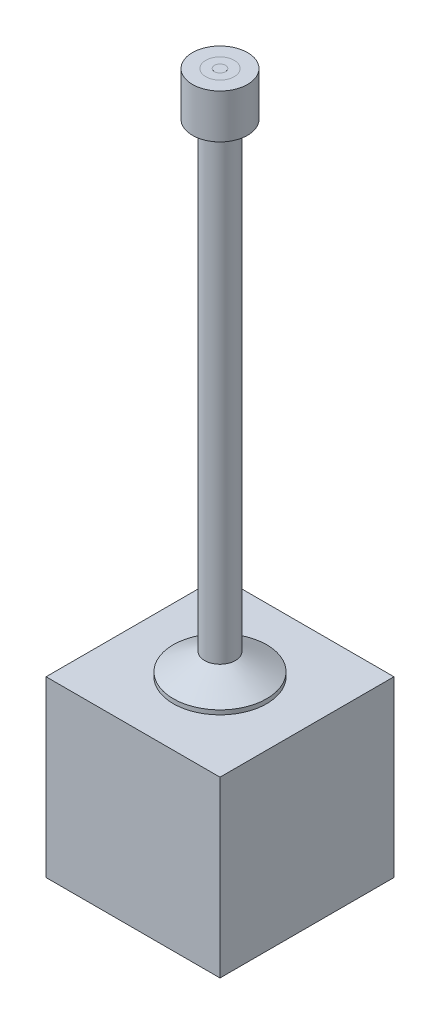
ISO-10303-21;
HEADER;
FILE_DESCRIPTION(('STEP AP214'),'2;1');
FILE_NAME('part.step','',(''),(''),'','','');
FILE_SCHEMA(('AUTOMOTIVE_DESIGN { 1 0 10303 214 1 1 1 1 }'));
ENDSEC;
DATA;
#1=APPLICATION_CONTEXT('core data for automotive mechanical design processes');
#2=APPLICATION_PROTOCOL_DEFINITION('international standard','automotive_design',2000,#1);
#3=PRODUCT_CONTEXT('',#1,'mechanical');
#4=PRODUCT('Part','Part','',(#3));
#5=PRODUCT_RELATED_PRODUCT_CATEGORY('part','',(#4));
#6=PRODUCT_DEFINITION_FORMATION('','',#4);
#7=PRODUCT_DEFINITION_CONTEXT('part definition',#1,'design');
#8=PRODUCT_DEFINITION('design','',#6,#7);
#9=PRODUCT_DEFINITION_SHAPE('','',#8);
#10=(LENGTH_UNIT() NAMED_UNIT(*) SI_UNIT(.MILLI.,.METRE.));
#11=(NAMED_UNIT(*) PLANE_ANGLE_UNIT() SI_UNIT($,.RADIAN.));
#12=(NAMED_UNIT(*) SI_UNIT($,.STERADIAN.) SOLID_ANGLE_UNIT());
#13=UNCERTAINTY_MEASURE_WITH_UNIT(LENGTH_MEASURE(1.E-05),#10,'distance_accuracy_value','');
#14=(GEOMETRIC_REPRESENTATION_CONTEXT(3) GLOBAL_UNCERTAINTY_ASSIGNED_CONTEXT((#13)) GLOBAL_UNIT_ASSIGNED_CONTEXT((#10,
#11,#12)) REPRESENTATION_CONTEXT('',''));
#15=CARTESIAN_POINT('',(0.,0.,0.));
#16=DIRECTION('',(0.,0.,1.));
#17=DIRECTION('',(1.,0.,0.));
#18=AXIS2_PLACEMENT_3D('',#15,#16,#17);
#19=CARTESIAN_POINT('',(10.,-20.,-10.));
#20=DIRECTION('',(-1.,0.,0.));
#21=DIRECTION('',(0.,-1.,0.));
#22=AXIS2_PLACEMENT_3D('',#19,#20,#21);
#23=PLANE('',#22);
#24=DIRECTION('',(0.,0.,1.));
#25=VECTOR('',#24,1.);
#26=CARTESIAN_POINT('',(10.,0.,-10.));
#27=LINE('',#26,#25);
#28=CARTESIAN_POINT('',(10.,0.,-10.));
#29=VERTEX_POINT('',#28);
#30=CARTESIAN_POINT('',(10.,0.,10.));
#31=VERTEX_POINT('',#30);
#32=EDGE_CURVE('E107',#29,#31,#27,.T.);
#33=ORIENTED_EDGE('',*,*,#32,.T.);
#34=DIRECTION('',(0.,1.,0.));
#35=VECTOR('',#34,1.);
#36=CARTESIAN_POINT('',(10.,-20.,10.));
#37=LINE('',#36,#35);
#38=CARTESIAN_POINT('',(10.,-20.,10.));
#39=VERTEX_POINT('',#38);
#40=EDGE_CURVE('E12',#39,#31,#37,.T.);
#41=ORIENTED_EDGE('',*,*,#40,.F.);
#42=DIRECTION('',(0.,0.,1.));
#43=VECTOR('',#42,1.);
#44=CARTESIAN_POINT('',(10.,-20.,-10.));
#45=LINE('',#44,#43);
#46=CARTESIAN_POINT('',(10.,-20.,-10.));
#47=VERTEX_POINT('',#46);
#48=EDGE_CURVE('E95',#47,#39,#45,.T.);
#49=ORIENTED_EDGE('',*,*,#48,.F.);
#50=DIRECTION('',(0.,1.,0.));
#51=VECTOR('',#50,1.);
#52=CARTESIAN_POINT('',(10.,-20.,-10.));
#53=LINE('',#52,#51);
#54=EDGE_CURVE('E103',#47,#29,#53,.T.);
#55=ORIENTED_EDGE('',*,*,#54,.T.);
#56=EDGE_LOOP('',(#33,#41,#49,#55));
#57=FACE_BOUND('',#56,.T.);
#58=ADVANCED_FACE('F44',(#57),#23,.F.);
#59=CARTESIAN_POINT('',(-10.,-20.,10.));
#60=DIRECTION('',(0.,0.,-1.));
#61=DIRECTION('',(-1.,0.,0.));
#62=AXIS2_PLACEMENT_3D('',#59,#60,#61);
#63=PLANE('',#62);
#64=DIRECTION('',(-1.,0.,0.));
#65=VECTOR('',#64,1.);
#66=CARTESIAN_POINT('',(-10.,0.,10.));
#67=LINE('',#66,#65);
#68=CARTESIAN_POINT('',(-10.,0.,10.));
#69=VERTEX_POINT('',#68);
#70=EDGE_CURVE('E99',#31,#69,#67,.T.);
#71=ORIENTED_EDGE('',*,*,#70,.T.);
#72=DIRECTION('',(0.,1.,0.));
#73=VECTOR('',#72,1.);
#74=CARTESIAN_POINT('',(-10.,-20.,10.));
#75=LINE('',#74,#73);
#76=CARTESIAN_POINT('',(-10.,-20.,10.));
#77=VERTEX_POINT('',#76);
#78=EDGE_CURVE('E52',#77,#69,#75,.T.);
#79=ORIENTED_EDGE('',*,*,#78,.F.);
#80=DIRECTION('',(-1.,0.,0.));
#81=VECTOR('',#80,1.);
#82=CARTESIAN_POINT('',(-10.,-20.,10.));
#83=LINE('',#82,#81);
#84=EDGE_CURVE('E90',#39,#77,#83,.T.);
#85=ORIENTED_EDGE('',*,*,#84,.F.);
#86=ORIENTED_EDGE('',*,*,#40,.T.);
#87=EDGE_LOOP('',(#71,#79,#85,#86));
#88=FACE_BOUND('',#87,.T.);
#89=ADVANCED_FACE('F98',(#88),#63,.F.);
#90=CARTESIAN_POINT('',(-10.,-20.,-10.));
#91=DIRECTION('',(1.,0.,0.));
#92=DIRECTION('',(0.,1.,0.));
#93=AXIS2_PLACEMENT_3D('',#90,#91,#92);
#94=PLANE('',#93);
#95=DIRECTION('',(0.,0.,-1.));
#96=VECTOR('',#95,1.);
#97=CARTESIAN_POINT('',(-10.,0.,-10.));
#98=LINE('',#97,#96);
#99=CARTESIAN_POINT('',(-10.,0.,-10.));
#100=VERTEX_POINT('',#99);
#101=EDGE_CURVE('E77',#69,#100,#98,.T.);
#102=ORIENTED_EDGE('',*,*,#101,.T.);
#103=DIRECTION('',(0.,1.,0.));
#104=VECTOR('',#103,1.);
#105=CARTESIAN_POINT('',(-10.,-20.,-10.));
#106=LINE('',#105,#104);
#107=CARTESIAN_POINT('',(-10.,-20.,-10.));
#108=VERTEX_POINT('',#107);
#109=EDGE_CURVE('E100',#108,#100,#106,.T.);
#110=ORIENTED_EDGE('',*,*,#109,.F.);
#111=DIRECTION('',(0.,0.,-1.));
#112=VECTOR('',#111,1.);
#113=CARTESIAN_POINT('',(-10.,-20.,-10.));
#114=LINE('',#113,#112);
#115=EDGE_CURVE('E93',#77,#108,#114,.T.);
#116=ORIENTED_EDGE('',*,*,#115,.F.);
#117=ORIENTED_EDGE('',*,*,#78,.T.);
#118=EDGE_LOOP('',(#102,#110,#116,#117));
#119=FACE_BOUND('',#118,.T.);
#120=ADVANCED_FACE('F101',(#119),#94,.F.);
#121=CARTESIAN_POINT('',(-10.,-20.,-10.));
#122=DIRECTION('',(0.,0.,1.));
#123=DIRECTION('',(1.,0.,0.));
#124=AXIS2_PLACEMENT_3D('',#121,#122,#123);
#125=PLANE('',#124);
#126=DIRECTION('',(1.,0.,0.));
#127=VECTOR('',#126,1.);
#128=CARTESIAN_POINT('',(-10.,0.,-10.));
#129=LINE('',#128,#127);
#130=EDGE_CURVE('E83',#100,#29,#129,.T.);
#131=ORIENTED_EDGE('',*,*,#130,.T.);
#132=ORIENTED_EDGE('',*,*,#54,.F.);
#133=DIRECTION('',(1.,0.,0.));
#134=VECTOR('',#133,1.);
#135=CARTESIAN_POINT('',(-10.,-20.,-10.));
#136=LINE('',#135,#134);
#137=EDGE_CURVE('E60',#108,#47,#136,.T.);
#138=ORIENTED_EDGE('',*,*,#137,.F.);
#139=ORIENTED_EDGE('',*,*,#109,.T.);
#140=EDGE_LOOP('',(#131,#132,#138,#139));
#141=FACE_BOUND('',#140,.T.);
#142=ADVANCED_FACE('F114',(#141),#125,.F.);
#143=CARTESIAN_POINT('',(0.,-20.,0.));
#144=DIRECTION('',(0.,1.,0.));
#145=DIRECTION('',(-1.,0.,0.));
#146=AXIS2_PLACEMENT_3D('',#143,#144,#145);
#147=PLANE('',#146);
#148=ORIENTED_EDGE('',*,*,#48,.T.);
#149=ORIENTED_EDGE('',*,*,#84,.T.);
#150=ORIENTED_EDGE('',*,*,#115,.T.);
#151=ORIENTED_EDGE('',*,*,#137,.T.);
#152=EDGE_LOOP('',(#148,#149,#150,#151));
#153=FACE_BOUND('',#152,.T.);
#154=ADVANCED_FACE('F91',(#153),#147,.F.);
#155=CARTESIAN_POINT('',(0.,0.,0.));
#156=DIRECTION('',(0.,1.,0.));
#157=DIRECTION('',(-1.,0.,0.));
#158=AXIS2_PLACEMENT_3D('',#155,#156,#157);
#159=PLANE('',#158);
#160=ORIENTED_EDGE('',*,*,#32,.F.);
#161=ORIENTED_EDGE('',*,*,#130,.F.);
#162=ORIENTED_EDGE('',*,*,#101,.F.);
#163=ORIENTED_EDGE('',*,*,#70,.F.);
#164=EDGE_LOOP('',(#160,#161,#162,#163));
#165=FACE_BOUND('',#164,.T.);
#166=ADVANCED_FACE('F117',(#165),#159,.T.);
#167=CLOSED_SHELL('',(#58,#89,#120,#142,#154,#166));
#168=MANIFOLD_SOLID_BREP('B2_NOT_SHOWN',#167);
#169=CARTESIAN_POINT('',(0.,55.5,0.));
#170=DIRECTION('',(0.,1.,0.));
#171=DIRECTION('',(0.,0.,1.));
#172=AXIS2_PLACEMENT_3D('',#169,#170,#171);
#173=CYLINDRICAL_SURFACE('',#172,0.375);
#174=CARTESIAN_POINT('',(0.,0.,0.));
#175=DIRECTION('',(0.,1.,0.));
#176=DIRECTION('',(0.,0.,1.));
#177=AXIS2_PLACEMENT_3D('',#174,#175,#176);
#178=CIRCLE('',#177,0.375);
#179=CARTESIAN_POINT('',(0.,0.,0.375));
#180=VERTEX_POINT('',#179);
#181=EDGE_CURVE('E197',#180,#180,#178,.T.);
#182=ORIENTED_EDGE('',*,*,#181,.F.);
#183=EDGE_LOOP('',(#182));
#184=FACE_BOUND('',#183,.T.);
#185=CARTESIAN_POINT('',(0.,54.9421933085502,0.));
#186=DIRECTION('',(0.,1.,0.));
#187=DIRECTION('',(0.,0.,1.));
#188=AXIS2_PLACEMENT_3D('',#185,#186,#187);
#189=CIRCLE('',#188,0.375);
#190=CARTESIAN_POINT('',(0.,54.9421933085502,0.375));
#191=VERTEX_POINT('',#190);
#192=EDGE_CURVE('E43',#191,#191,#189,.T.);
#193=ORIENTED_EDGE('',*,*,#192,.T.);
#194=EDGE_LOOP('',(#193));
#195=FACE_BOUND('',#194,.T.);
#196=ADVANCED_FACE('F175',(#184,#195),#173,.F.);
#197=CARTESIAN_POINT('',(0.,60.571,0.));
#198=DIRECTION('',(0.,1.,0.));
#199=DIRECTION('',(0.,0.,1.));
#200=AXIS2_PLACEMENT_3D('',#197,#198,#199);
#201=CONICAL_SURFACE('',#200,0.635000000000092,0.0461581536129454);
#202=ORIENTED_EDGE('',*,*,#192,.F.);
#203=EDGE_LOOP('',(#202));
#204=FACE_BOUND('',#203,.T.);
#205=CARTESIAN_POINT('',(0.,60.571,0.));
#206=DIRECTION('',(0.,1.,0.));
#207=DIRECTION('',(0.,0.,1.));
#208=AXIS2_PLACEMENT_3D('',#205,#206,#207);
#209=CIRCLE('',#208,0.635000000000092);
#210=CARTESIAN_POINT('',(0.,60.571,0.635000000000092));
#211=VERTEX_POINT('',#210);
#212=EDGE_CURVE('E181',#211,#211,#209,.T.);
#213=ORIENTED_EDGE('',*,*,#212,.T.);
#214=EDGE_LOOP('',(#213));
#215=FACE_BOUND('',#214,.T.);
#216=ADVANCED_FACE('F204',(#204,#215),#201,.F.);
#217=CARTESIAN_POINT('',(0.635000000000092,60.571,0.));
#218=DIRECTION('',(0.,-1.,0.));
#219=DIRECTION('',(0.,0.,-1.));
#220=AXIS2_PLACEMENT_3D('',#217,#218,#219);
#221=PLANE('',#220);
#222=ORIENTED_EDGE('',*,*,#212,.F.);
#223=EDGE_LOOP('',(#222));
#224=FACE_BOUND('',#223,.T.);
#225=CARTESIAN_POINT('',(0.,60.571,0.));
#226=DIRECTION('',(0.,1.,0.));
#227=DIRECTION('',(0.,0.,1.));
#228=AXIS2_PLACEMENT_3D('',#225,#226,#227);
#229=CIRCLE('',#228,1.63500000000009);
#230=CARTESIAN_POINT('',(0.,60.571,1.63500000000009));
#231=VERTEX_POINT('',#230);
#232=EDGE_CURVE('E185',#231,#231,#229,.T.);
#233=ORIENTED_EDGE('',*,*,#232,.T.);
#234=EDGE_LOOP('',(#233));
#235=FACE_BOUND('',#234,.T.);
#236=ADVANCED_FACE('F208',(#224,#235),#221,.F.);
#237=CARTESIAN_POINT('',(0.,54.9421933085502,0.));
#238=DIRECTION('',(0.,1.,0.));
#239=DIRECTION('',(0.,0.,1.));
#240=AXIS2_PLACEMENT_3D('',#237,#238,#239);
#241=CONICAL_SURFACE('',#240,1.37500000000001,0.0461581536129434);
#242=ORIENTED_EDGE('',*,*,#232,.F.);
#243=EDGE_LOOP('',(#242));
#244=FACE_BOUND('',#243,.T.);
#245=CARTESIAN_POINT('',(0.,54.9421933085502,0.));
#246=DIRECTION('',(0.,1.,0.));
#247=DIRECTION('',(0.,0.,1.));
#248=AXIS2_PLACEMENT_3D('',#245,#246,#247);
#249=CIRCLE('',#248,1.37500000000001);
#250=CARTESIAN_POINT('',(0.,54.9421933085502,1.37500000000001));
#251=VERTEX_POINT('',#250);
#252=EDGE_CURVE('E189',#251,#251,#249,.T.);
#253=ORIENTED_EDGE('',*,*,#252,.T.);
#254=EDGE_LOOP('',(#253));
#255=FACE_BOUND('',#254,.T.);
#256=ADVANCED_FACE('F213',(#244,#255),#241,.T.);
#257=CARTESIAN_POINT('',(0.,55.5,0.));
#258=DIRECTION('',(0.,1.,0.));
#259=DIRECTION('',(0.,0.,1.));
#260=AXIS2_PLACEMENT_3D('',#257,#258,#259);
#261=CYLINDRICAL_SURFACE('',#260,1.37500000000001);
#262=ORIENTED_EDGE('',*,*,#252,.F.);
#263=EDGE_LOOP('',(#262));
#264=FACE_BOUND('',#263,.T.);
#265=CARTESIAN_POINT('',(0.,0.,0.));
#266=DIRECTION('',(0.,1.,0.));
#267=DIRECTION('',(0.,0.,1.));
#268=AXIS2_PLACEMENT_3D('',#265,#266,#267);
#269=CIRCLE('',#268,1.37500000000001);
#270=CARTESIAN_POINT('',(0.,0.,1.37500000000001));
#271=VERTEX_POINT('',#270);
#272=EDGE_CURVE('E194',#271,#271,#269,.T.);
#273=ORIENTED_EDGE('',*,*,#272,.T.);
#274=EDGE_LOOP('',(#273));
#275=FACE_BOUND('',#274,.T.);
#276=ADVANCED_FACE('F219',(#264,#275),#261,.T.);
#277=CARTESIAN_POINT('',(0.375,0.,0.));
#278=DIRECTION('',(0.,1.,0.));
#279=DIRECTION('',(0.,0.,1.));
#280=AXIS2_PLACEMENT_3D('',#277,#278,#279);
#281=PLANE('',#280);
#282=ORIENTED_EDGE('',*,*,#272,.F.);
#283=EDGE_LOOP('',(#282));
#284=FACE_BOUND('',#283,.T.);
#285=ORIENTED_EDGE('',*,*,#181,.T.);
#286=EDGE_LOOP('',(#285));
#287=FACE_BOUND('',#286,.T.);
#288=ADVANCED_FACE('F201',(#284,#287),#281,.F.);
#289=CLOSED_SHELL('',(#196,#216,#236,#256,#276,#288));
#290=MANIFOLD_SOLID_BREP('B6',#289);
#291=CARTESIAN_POINT('',(1.37500000000001,0.,0.));
#292=DIRECTION('',(0.,1.,0.));
#293=DIRECTION('',(-1.,0.,0.));
#294=AXIS2_PLACEMENT_3D('',#291,#292,#293);
#295=PLANE('',#294);
#296=CARTESIAN_POINT('',(0.,0.,0.));
#297=DIRECTION('',(0.,1.,0.));
#298=DIRECTION('',(-1.,0.,0.));
#299=AXIS2_PLACEMENT_3D('',#296,#297,#298);
#300=CIRCLE('',#299,5.375);
#301=CARTESIAN_POINT('',(-5.375,0.,0.));
#302=VERTEX_POINT('',#301);
#303=EDGE_CURVE('E174',#302,#302,#300,.T.);
#304=ORIENTED_EDGE('',*,*,#303,.F.);
#305=EDGE_LOOP('',(#304));
#306=FACE_BOUND('',#305,.T.);
#307=CARTESIAN_POINT('',(0.,0.,0.));
#308=DIRECTION('',(0.,1.,0.));
#309=DIRECTION('',(-1.,0.,0.));
#310=AXIS2_PLACEMENT_3D('',#307,#308,#309);
#311=CIRCLE('',#310,1.37500000000001);
#312=CARTESIAN_POINT('',(-1.37500000000001,0.,0.));
#313=VERTEX_POINT('',#312);
#314=EDGE_CURVE('E317',#313,#313,#311,.T.);
#315=ORIENTED_EDGE('',*,*,#314,.T.);
#316=EDGE_LOOP('',(#315));
#317=FACE_BOUND('',#316,.T.);
#318=ADVANCED_FACE('F286',(#306,#317),#295,.F.);
#319=CARTESIAN_POINT('',(0.,60.571,0.));
#320=DIRECTION('',(0.,1.,0.));
#321=DIRECTION('',(-1.,0.,0.));
#322=AXIS2_PLACEMENT_3D('',#319,#320,#321);
#323=CYLINDRICAL_SURFACE('',#322,5.375);
#324=CARTESIAN_POINT('',(0.,0.5,0.));
#325=DIRECTION('',(0.,1.,0.));
#326=DIRECTION('',(-1.,0.,0.));
#327=AXIS2_PLACEMENT_3D('',#324,#325,#326);
#328=CIRCLE('',#327,5.375);
#329=CARTESIAN_POINT('',(5.375,0.500000000000001,0.));
#330=VERTEX_POINT('',#329);
#331=EDGE_CURVE('E292',#330,#330,#328,.T.);
#332=ORIENTED_EDGE('',*,*,#331,.F.);
#333=EDGE_LOOP('',(#332));
#334=FACE_BOUND('',#333,.T.);
#335=ORIENTED_EDGE('',*,*,#303,.T.);
#336=EDGE_LOOP('',(#335));
#337=FACE_BOUND('',#336,.T.);
#338=ADVANCED_FACE('F360',(#334,#337),#323,.T.);
#339=CARTESIAN_POINT('',(0.,0.5,0.));
#340=DIRECTION('',(0.,-1.,0.));
#341=DIRECTION('',(1.,0.,0.));
#342=AXIS2_PLACEMENT_3D('',#339,#340,#341);
#343=CONICAL_SURFACE('',#342,5.375,1.06310757338599);
#344=CARTESIAN_POINT('',(0.,2.5,0.));
#345=DIRECTION('',(0.,1.,0.));
#346=DIRECTION('',(-1.,0.,0.));
#347=AXIS2_PLACEMENT_3D('',#344,#345,#346);
#348=CIRCLE('',#347,1.78);
#349=CARTESIAN_POINT('',(1.78,2.5,0.));
#350=VERTEX_POINT('',#349);
#351=EDGE_CURVE('E296',#350,#350,#348,.T.);
#352=CARTESIAN_POINT('',(1.78,2.5,0.));
#353=CARTESIAN_POINT('',(1.81744791666667,2.47916666666667,0.));
#354=CARTESIAN_POINT('',(1.85489583333333,2.45833333333334,0.));
#355=CARTESIAN_POINT('',(1.92979166666667,2.41666666666667,0.));
#356=CARTESIAN_POINT('',(1.96723958333333,2.39583333333334,0.));
#357=CARTESIAN_POINT('',(2.04213541666667,2.35416666666667,0.));
#358=CARTESIAN_POINT('',(2.07958333333333,2.33333333333334,0.));
#359=CARTESIAN_POINT('',(2.15447916666667,2.29166666666667,0.));
#360=CARTESIAN_POINT('',(2.19192708333333,2.27083333333334,0.));
#361=CARTESIAN_POINT('',(2.26682291666667,2.22916666666667,0.));
#362=CARTESIAN_POINT('',(2.30427083333333,2.20833333333334,0.));
#363=CARTESIAN_POINT('',(2.37916666666667,2.16666666666667,0.));
#364=CARTESIAN_POINT('',(2.41661458333333,2.14583333333334,0.));
#365=CARTESIAN_POINT('',(2.49151041666667,2.10416666666667,0.));
#366=CARTESIAN_POINT('',(2.52895833333333,2.08333333333334,0.));
#367=CARTESIAN_POINT('',(2.60385416666667,2.04166666666667,0.));
#368=CARTESIAN_POINT('',(2.64130208333333,2.02083333333333,0.));
#369=CARTESIAN_POINT('',(2.71619791666667,1.97916666666667,0.));
#370=CARTESIAN_POINT('',(2.75364583333333,1.95833333333334,0.));
#371=CARTESIAN_POINT('',(2.82854166666667,1.91666666666667,0.));
#372=CARTESIAN_POINT('',(2.86598958333333,1.89583333333334,0.));
#373=CARTESIAN_POINT('',(2.94088541666667,1.85416666666667,0.));
#374=CARTESIAN_POINT('',(2.97833333333333,1.83333333333334,0.));
#375=CARTESIAN_POINT('',(3.05322916666667,1.79166666666667,0.));
#376=CARTESIAN_POINT('',(3.09067708333333,1.77083333333334,0.));
#377=CARTESIAN_POINT('',(3.16557291666667,1.72916666666667,0.));
#378=CARTESIAN_POINT('',(3.20302083333333,1.70833333333333,0.));
#379=CARTESIAN_POINT('',(3.27791666666667,1.66666666666667,0.));
#380=CARTESIAN_POINT('',(3.31536458333333,1.64583333333333,0.));
#381=CARTESIAN_POINT('',(3.39026041666667,1.60416666666667,0.));
#382=CARTESIAN_POINT('',(3.42770833333333,1.58333333333333,0.));
#383=CARTESIAN_POINT('',(3.50260416666667,1.54166666666667,0.));
#384=CARTESIAN_POINT('',(3.54005208333333,1.52083333333333,0.));
#385=CARTESIAN_POINT('',(3.61494791666667,1.47916666666667,0.));
#386=CARTESIAN_POINT('',(3.65239583333333,1.45833333333333,0.));
#387=CARTESIAN_POINT('',(3.72729166666667,1.41666666666667,0.));
#388=CARTESIAN_POINT('',(3.76473958333333,1.39583333333333,0.));
#389=CARTESIAN_POINT('',(3.83963541666667,1.35416666666667,0.));
#390=CARTESIAN_POINT('',(3.87708333333333,1.33333333333333,0.));
#391=CARTESIAN_POINT('',(3.95197916666667,1.29166666666667,0.));
#392=CARTESIAN_POINT('',(3.98942708333333,1.27083333333333,0.));
#393=CARTESIAN_POINT('',(4.06432291666667,1.22916666666667,0.));
#394=CARTESIAN_POINT('',(4.10177083333333,1.20833333333333,0.));
#395=CARTESIAN_POINT('',(4.17666666666667,1.16666666666667,0.));
#396=CARTESIAN_POINT('',(4.21411458333333,1.14583333333333,0.));
#397=CARTESIAN_POINT('',(4.28901041666667,1.10416666666667,0.));
#398=CARTESIAN_POINT('',(4.32645833333333,1.08333333333333,0.));
#399=CARTESIAN_POINT('',(4.40135416666667,1.04166666666667,0.));
#400=CARTESIAN_POINT('',(4.43880208333333,1.02083333333333,0.));
#401=CARTESIAN_POINT('',(4.51369791666667,0.979166666666668,0.));
#402=CARTESIAN_POINT('',(4.55114583333333,0.958333333333334,0.));
#403=CARTESIAN_POINT('',(4.62604166666667,0.916666666666667,0.));
#404=CARTESIAN_POINT('',(4.66348958333333,0.895833333333334,0.));
#405=CARTESIAN_POINT('',(4.73838541666667,0.854166666666667,0.));
#406=CARTESIAN_POINT('',(4.77583333333333,0.833333333333334,0.));
#407=CARTESIAN_POINT('',(4.85072916666667,0.791666666666667,0.));
#408=CARTESIAN_POINT('',(4.88817708333333,0.770833333333334,0.));
#409=CARTESIAN_POINT('',(4.96307291666667,0.729166666666667,0.));
#410=CARTESIAN_POINT('',(5.00052083333333,0.708333333333334,0.));
#411=CARTESIAN_POINT('',(5.07541666666667,0.666666666666667,0.));
#412=CARTESIAN_POINT('',(5.11286458333333,0.645833333333334,0.));
#413=CARTESIAN_POINT('',(5.18776041666667,0.604166666666667,0.));
#414=CARTESIAN_POINT('',(5.22520833333333,0.583333333333334,0.));
#415=CARTESIAN_POINT('',(5.30010416666667,0.541666666666667,0.));
#416=CARTESIAN_POINT('',(5.33755208333333,0.520833333333334,0.));
#417=CARTESIAN_POINT('',(5.375,0.5,0.));
#418=B_SPLINE_CURVE_WITH_KNOTS('',3,(#352,#353,#354,#355,#356,#357,#358,#359,#360,#361,#362,
#363,#364,#365,#366,#367,#368,#369,#370,#371,#372,#373,#374,#375,#376,#377,#378,#379,#380,#381,
#382,#383,#384,#385,#386,#387,#388,#389,#390,#391,#392,#393,#394,#395,#396,#397,#398,#399,#400,
#401,#402,#403,#404,#405,#406,#407,#408,#409,#410,#411,#412,#413,#414,#415,#416,#417),
.UNSPECIFIED.,.F.,.F.,(4,2,2,2,2,2,2,2,2,2,2,2,2,2,2,2,2,2,2,2,2,2,2,2,2,2,2,2,2,2,2,2,4),(0.,
0.128558812082496,0.257117624164992,0.385676436247487,0.514235248329983,0.642794060412479,
0.771352872494975,0.899911684577471,1.02847049665997,1.15702930874246,1.28558812082496,
1.41414693290746,1.54270574498995,1.67126455707245,1.79982336915494,1.92838218123744,
2.05694099331993,2.18549980540243,2.31405861748493,2.44261742956742,2.57117624164992,
2.69973505373241,2.82829386581491,2.9568526778974,3.0854114899799,3.2139703020624,
3.34252911414489,3.47108792622739,3.59964673830988,3.72820555039238,3.85676436247488,
3.98532317455737,4.11388198663987),.UNSPECIFIED.);
#419=EDGE_CURVE('BSEAM355',#350,#330,#418,.T.);
#420=ORIENTED_EDGE('',*,*,#351,.F.);
#421=ORIENTED_EDGE('',*,*,#331,.T.);
#422=ORIENTED_EDGE('',*,*,#419,.T.);
#423=ORIENTED_EDGE('',*,*,#419,.F.);
#424=EDGE_LOOP('',(#420,#422,#421,#423));
#425=FACE_BOUND('',#424,.T.);
#426=ADVANCED_FACE('F355',(#425),#343,.T.);
#427=CARTESIAN_POINT('',(0.,60.571,0.));
#428=DIRECTION('',(0.,1.,0.));
#429=DIRECTION('',(-1.,0.,0.));
#430=AXIS2_PLACEMENT_3D('',#427,#428,#429);
#431=CYLINDRICAL_SURFACE('',#430,1.78);
#432=CARTESIAN_POINT('',(0.,54.5,0.));
#433=DIRECTION('',(0.,1.,0.));
#434=DIRECTION('',(-1.,0.,0.));
#435=AXIS2_PLACEMENT_3D('',#432,#433,#434);
#436=CIRCLE('',#435,1.78);
#437=CARTESIAN_POINT('',(-1.78,54.5,0.));
#438=VERTEX_POINT('',#437);
#439=EDGE_CURVE('E300',#438,#438,#436,.T.);
#440=ORIENTED_EDGE('',*,*,#439,.F.);
#441=EDGE_LOOP('',(#440));
#442=FACE_BOUND('',#441,.T.);
#443=ORIENTED_EDGE('',*,*,#351,.T.);
#444=EDGE_LOOP('',(#443));
#445=FACE_BOUND('',#444,.T.);
#446=ADVANCED_FACE('F349',(#442,#445),#431,.T.);
#447=CARTESIAN_POINT('',(0.,54.5,0.));
#448=DIRECTION('',(0.,1.,0.));
#449=DIRECTION('',(-1.,0.,0.));
#450=AXIS2_PLACEMENT_3D('',#447,#448,#449);
#451=CONICAL_SURFACE('',#450,1.78,0.947760988153379);
#452=CARTESIAN_POINT('',(0.,55.5,0.));
#453=DIRECTION('',(0.,1.,0.));
#454=DIRECTION('',(-1.,0.,0.));
#455=AXIS2_PLACEMENT_3D('',#452,#453,#454);
#456=CIRCLE('',#455,3.17178589149484);
#457=CARTESIAN_POINT('',(-3.17178589149484,55.5,0.));
#458=VERTEX_POINT('',#457);
#459=EDGE_CURVE('E305',#458,#458,#456,.T.);
#460=ORIENTED_EDGE('',*,*,#459,.F.);
#461=EDGE_LOOP('',(#460));
#462=FACE_BOUND('',#461,.T.);
#463=ORIENTED_EDGE('',*,*,#439,.T.);
#464=EDGE_LOOP('',(#463));
#465=FACE_BOUND('',#464,.T.);
#466=ADVANCED_FACE('F343',(#462,#465),#451,.T.);
#467=CARTESIAN_POINT('',(0.,60.571,0.));
#468=DIRECTION('',(0.,1.,0.));
#469=DIRECTION('',(-1.,0.,0.));
#470=AXIS2_PLACEMENT_3D('',#467,#468,#469);
#471=CYLINDRICAL_SURFACE('',#470,3.17178589149484);
#472=CARTESIAN_POINT('',(0.,60.571,0.));
#473=DIRECTION('',(0.,1.,0.));
#474=DIRECTION('',(-1.,0.,0.));
#475=AXIS2_PLACEMENT_3D('',#472,#473,#474);
#476=CIRCLE('',#475,3.17178589149484);
#477=CARTESIAN_POINT('',(-3.17178589149484,60.571,0.));
#478=VERTEX_POINT('',#477);
#479=EDGE_CURVE('E308',#478,#478,#476,.T.);
#480=ORIENTED_EDGE('',*,*,#479,.F.);
#481=EDGE_LOOP('',(#480));
#482=FACE_BOUND('',#481,.T.);
#483=ORIENTED_EDGE('',*,*,#459,.T.);
#484=EDGE_LOOP('',(#483));
#485=FACE_BOUND('',#484,.T.);
#486=ADVANCED_FACE('F337',(#482,#485),#471,.T.);
#487=CARTESIAN_POINT('',(3.17178589149484,60.571,0.));
#488=DIRECTION('',(0.,-1.,0.));
#489=DIRECTION('',(1.,0.,0.));
#490=AXIS2_PLACEMENT_3D('',#487,#488,#489);
#491=PLANE('',#490);
#492=CARTESIAN_POINT('',(0.,60.571,0.));
#493=DIRECTION('',(0.,1.,0.));
#494=DIRECTION('',(-1.,0.,0.));
#495=AXIS2_PLACEMENT_3D('',#492,#493,#494);
#496=CIRCLE('',#495,1.63500000000009);
#497=CARTESIAN_POINT('',(-1.63500000000009,60.571,0.));
#498=VERTEX_POINT('',#497);
#499=EDGE_CURVE('E311',#498,#498,#496,.T.);
#500=ORIENTED_EDGE('',*,*,#499,.F.);
#501=EDGE_LOOP('',(#500));
#502=FACE_BOUND('',#501,.T.);
#503=ORIENTED_EDGE('',*,*,#479,.T.);
#504=EDGE_LOOP('',(#503));
#505=FACE_BOUND('',#504,.T.);
#506=ADVANCED_FACE('F331',(#502,#505),#491,.F.);
#507=CARTESIAN_POINT('',(0.,60.571,0.));
#508=DIRECTION('',(0.,1.,0.));
#509=DIRECTION('',(-1.,0.,0.));
#510=AXIS2_PLACEMENT_3D('',#507,#508,#509);
#511=CONICAL_SURFACE('',#510,1.63500000000009,0.0461581536129434);
#512=CARTESIAN_POINT('',(0.,54.9421933085502,0.));
#513=DIRECTION('',(0.,1.,0.));
#514=DIRECTION('',(-1.,0.,0.));
#515=AXIS2_PLACEMENT_3D('',#512,#513,#514);
#516=CIRCLE('',#515,1.37500000000001);
#517=CARTESIAN_POINT('',(-1.37500000000001,54.9421933085502,0.));
#518=VERTEX_POINT('',#517);
#519=EDGE_CURVE('E314',#518,#518,#516,.T.);
#520=ORIENTED_EDGE('',*,*,#519,.F.);
#521=EDGE_LOOP('',(#520));
#522=FACE_BOUND('',#521,.T.);
#523=ORIENTED_EDGE('',*,*,#499,.T.);
#524=EDGE_LOOP('',(#523));
#525=FACE_BOUND('',#524,.T.);
#526=ADVANCED_FACE('F325',(#522,#525),#511,.F.);
#527=CARTESIAN_POINT('',(0.,60.571,0.));
#528=DIRECTION('',(0.,1.,0.));
#529=DIRECTION('',(-1.,0.,0.));
#530=AXIS2_PLACEMENT_3D('',#527,#528,#529);
#531=CYLINDRICAL_SURFACE('',#530,1.37500000000001);
#532=ORIENTED_EDGE('',*,*,#314,.F.);
#533=EDGE_LOOP('',(#532));
#534=FACE_BOUND('',#533,.T.);
#535=ORIENTED_EDGE('',*,*,#519,.T.);
#536=EDGE_LOOP('',(#535));
#537=FACE_BOUND('',#536,.T.);
#538=ADVANCED_FACE('F322',(#534,#537),#531,.F.);
#539=CLOSED_SHELL('',(#318,#338,#426,#446,#466,#486,#506,#526,#538));
#540=MANIFOLD_SOLID_BREP('B38',#539);
#541=CARTESIAN_POINT('',(0.63500000000009,60.571,0.));
#542=DIRECTION('',(0.,-1.,0.));
#543=DIRECTION('',(1.,0.,0.));
#544=AXIS2_PLACEMENT_3D('',#541,#542,#543);
#545=PLANE('',#544);
#546=CARTESIAN_POINT('',(0.,60.571,0.));
#547=DIRECTION('',(0.,1.,0.));
#548=DIRECTION('',(-1.,0.,0.));
#549=AXIS2_PLACEMENT_3D('',#546,#547,#548);
#550=CIRCLE('',#549,0.63500000000009);
#551=CARTESIAN_POINT('',(-0.63500000000009,60.571,0.));
#552=VERTEX_POINT('',#551);
#553=EDGE_CURVE('E285',#552,#552,#550,.T.);
#554=ORIENTED_EDGE('',*,*,#553,.T.);
#555=EDGE_LOOP('',(#554));
#556=FACE_BOUND('',#555,.T.);
#557=ADVANCED_FACE('F426',(#556),#545,.F.);
#558=CARTESIAN_POINT('',(0.,54.9421933085502,0.));
#559=DIRECTION('',(0.,1.,0.));
#560=DIRECTION('',(-1.,0.,0.));
#561=AXIS2_PLACEMENT_3D('',#558,#559,#560);
#562=CONICAL_SURFACE('',#561,0.375,0.0461581536129451);
#563=ORIENTED_EDGE('',*,*,#553,.F.);
#564=EDGE_LOOP('',(#563));
#565=FACE_BOUND('',#564,.T.);
#566=CARTESIAN_POINT('',(0.,54.9421933085502,0.));
#567=DIRECTION('',(0.,1.,0.));
#568=DIRECTION('',(-1.,0.,0.));
#569=AXIS2_PLACEMENT_3D('',#566,#567,#568);
#570=CIRCLE('',#569,0.375);
#571=CARTESIAN_POINT('',(-0.375,54.9421933085502,0.));
#572=VERTEX_POINT('',#571);
#573=EDGE_CURVE('E432',#572,#572,#570,.T.);
#574=ORIENTED_EDGE('',*,*,#573,.T.);
#575=EDGE_LOOP('',(#574));
#576=FACE_BOUND('',#575,.T.);
#577=ADVANCED_FACE('F451',(#565,#576),#562,.T.);
#578=CARTESIAN_POINT('',(0.,60.571,0.));
#579=DIRECTION('',(0.,1.,0.));
#580=DIRECTION('',(-1.,0.,0.));
#581=AXIS2_PLACEMENT_3D('',#578,#579,#580);
#582=CYLINDRICAL_SURFACE('',#581,0.375);
#583=ORIENTED_EDGE('',*,*,#573,.F.);
#584=EDGE_LOOP('',(#583));
#585=FACE_BOUND('',#584,.T.);
#586=CARTESIAN_POINT('',(0.,0.,0.));
#587=DIRECTION('',(0.,1.,0.));
#588=DIRECTION('',(-1.,0.,0.));
#589=AXIS2_PLACEMENT_3D('',#586,#587,#588);
#590=CIRCLE('',#589,0.375);
#591=CARTESIAN_POINT('',(-0.375,0.,0.));
#592=VERTEX_POINT('',#591);
#593=EDGE_CURVE('E436',#592,#592,#590,.T.);
#594=ORIENTED_EDGE('',*,*,#593,.T.);
#595=EDGE_LOOP('',(#594));
#596=FACE_BOUND('',#595,.T.);
#597=ADVANCED_FACE('F443',(#585,#596),#582,.T.);
#598=CARTESIAN_POINT('',(0.375,0.,0.));
#599=DIRECTION('',(0.,1.,0.));
#600=DIRECTION('',(-1.,0.,0.));
#601=AXIS2_PLACEMENT_3D('',#598,#599,#600);
#602=PLANE('',#601);
#603=ORIENTED_EDGE('',*,*,#593,.F.);
#604=EDGE_LOOP('',(#603));
#605=FACE_BOUND('',#604,.T.);
#606=ADVANCED_FACE('F445',(#605),#602,.F.);
#607=CLOSED_SHELL('',(#557,#577,#597,#606));
#608=MANIFOLD_SOLID_BREP('B169',#607);
#609=ADVANCED_BREP_SHAPE_REPRESENTATION('',(#18,#168,#290,#540,#608),#14);
#610=SHAPE_DEFINITION_REPRESENTATION(#9,#609);
ENDSEC;
END-ISO-10303-21;
